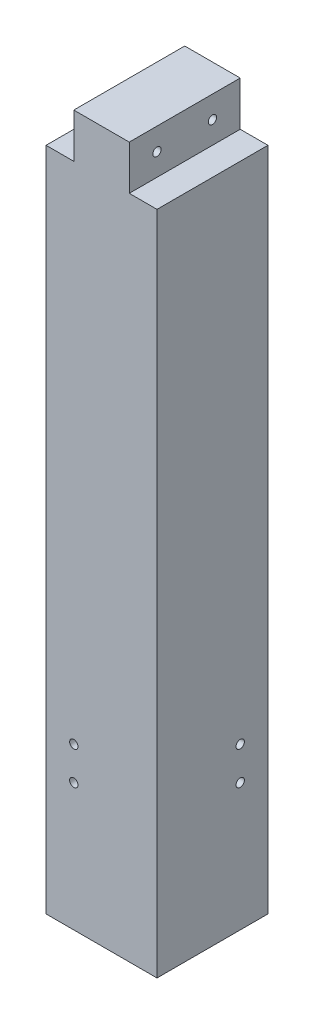
ISO-10303-21;
HEADER;
FILE_DESCRIPTION(('STEP AP214'),'2;1');
FILE_NAME('part.step','',(''),(''),'','','');
FILE_SCHEMA(('AUTOMOTIVE_DESIGN { 1 0 10303 214 1 1 1 1 }'));
ENDSEC;
DATA;
#1=APPLICATION_CONTEXT('core data for automotive mechanical design processes');
#2=APPLICATION_PROTOCOL_DEFINITION('international standard','automotive_design',2000,#1);
#3=PRODUCT_CONTEXT('',#1,'mechanical');
#4=PRODUCT('Part','Part','',(#3));
#5=PRODUCT_RELATED_PRODUCT_CATEGORY('part','',(#4));
#6=PRODUCT_DEFINITION_FORMATION('','',#4);
#7=PRODUCT_DEFINITION_CONTEXT('part definition',#1,'design');
#8=PRODUCT_DEFINITION('design','',#6,#7);
#9=PRODUCT_DEFINITION_SHAPE('','',#8);
#10=(LENGTH_UNIT() NAMED_UNIT(*) SI_UNIT(.MILLI.,.METRE.));
#11=(NAMED_UNIT(*) PLANE_ANGLE_UNIT() SI_UNIT($,.RADIAN.));
#12=(NAMED_UNIT(*) SI_UNIT($,.STERADIAN.) SOLID_ANGLE_UNIT());
#13=UNCERTAINTY_MEASURE_WITH_UNIT(LENGTH_MEASURE(1.E-05),#10,'distance_accuracy_value','');
#14=(GEOMETRIC_REPRESENTATION_CONTEXT(3) GLOBAL_UNCERTAINTY_ASSIGNED_CONTEXT((#13)) GLOBAL_UNIT_ASSIGNED_CONTEXT((#10,
#11,#12)) REPRESENTATION_CONTEXT('',''));
#15=CARTESIAN_POINT('',(0.,0.,0.));
#16=DIRECTION('',(0.,0.,1.));
#17=DIRECTION('',(1.,0.,0.));
#18=AXIS2_PLACEMENT_3D('',#15,#16,#17);
#19=CARTESIAN_POINT('',(0.,431.799999999999,-127.));
#20=DIRECTION('',(0.,1.,0.));
#21=DIRECTION('',(0.,0.,1.));
#22=AXIS2_PLACEMENT_3D('',#19,#20,#21);
#23=PLANE('',#22);
#24=DIRECTION('',(-1.,0.,0.));
#25=VECTOR('',#24,1.);
#26=CARTESIAN_POINT('',(0.,431.799999999999,0.));
#27=LINE('',#26,#25);
#28=CARTESIAN_POINT('',(31.75,431.799999999999,0.));
#29=VERTEX_POINT('',#28);
#30=CARTESIAN_POINT('',(-31.75,431.799999999999,0.));
#31=VERTEX_POINT('',#30);
#32=EDGE_CURVE('E233',#29,#31,#27,.T.);
#33=ORIENTED_EDGE('',*,*,#32,.F.);
#34=DIRECTION('',(0.,0.,1.));
#35=VECTOR('',#34,1.);
#36=CARTESIAN_POINT('',(31.75,431.799999999999,-127.));
#37=LINE('',#36,#35);
#38=CARTESIAN_POINT('',(31.75,431.799999999999,-127.));
#39=VERTEX_POINT('',#38);
#40=EDGE_CURVE('E11',#39,#29,#37,.T.);
#41=ORIENTED_EDGE('',*,*,#40,.F.);
#42=DIRECTION('',(-1.,0.,0.));
#43=VECTOR('',#42,1.);
#44=CARTESIAN_POINT('',(0.,431.799999999999,-127.));
#45=LINE('',#44,#43);
#46=CARTESIAN_POINT('',(-31.75,431.799999999999,-127.));
#47=VERTEX_POINT('',#46);
#48=EDGE_CURVE('E222',#39,#47,#45,.T.);
#49=ORIENTED_EDGE('',*,*,#48,.T.);
#50=DIRECTION('',(0.,0.,1.));
#51=VECTOR('',#50,1.);
#52=CARTESIAN_POINT('',(-31.75,431.799999999999,-127.));
#53=LINE('',#52,#51);
#54=EDGE_CURVE('E232',#47,#31,#53,.T.);
#55=ORIENTED_EDGE('',*,*,#54,.T.);
#56=EDGE_LOOP('',(#33,#41,#49,#55));
#57=FACE_BOUND('',#56,.T.);
#58=ADVANCED_FACE('F36',(#57),#23,.T.);
#59=CARTESIAN_POINT('',(31.7500000000001,0.,-127.));
#60=DIRECTION('',(-1.,0.,0.));
#61=DIRECTION('',(0.,-1.,0.));
#62=AXIS2_PLACEMENT_3D('',#59,#60,#61);
#63=PLANE('',#62);
#64=CARTESIAN_POINT('',(31.75,406.399999999999,-31.75));
#65=DIRECTION('',(-1.,0.,0.));
#66=DIRECTION('',(0.,-1.,0.));
#67=AXIS2_PLACEMENT_3D('',#64,#65,#66);
#68=CIRCLE('',#67,4.7625);
#69=CARTESIAN_POINT('',(31.75,401.637499999999,-31.75));
#70=VERTEX_POINT('',#69);
#71=EDGE_CURVE('E652',#70,#70,#68,.T.);
#72=ORIENTED_EDGE('',*,*,#71,.T.);
#73=EDGE_LOOP('',(#72));
#74=FACE_BOUND('',#73,.T.);
#75=CARTESIAN_POINT('',(31.75,406.399999999999,-95.25));
#76=DIRECTION('',(-1.,0.,0.));
#77=DIRECTION('',(0.,-1.,0.));
#78=AXIS2_PLACEMENT_3D('',#75,#76,#77);
#79=CIRCLE('',#78,4.7625);
#80=CARTESIAN_POINT('',(31.75,401.637499999999,-95.25));
#81=VERTEX_POINT('',#80);
#82=EDGE_CURVE('E657',#81,#81,#79,.T.);
#83=ORIENTED_EDGE('',*,*,#82,.T.);
#84=EDGE_LOOP('',(#83));
#85=FACE_BOUND('',#84,.T.);
#86=DIRECTION('',(0.,-1.,0.));
#87=VECTOR('',#86,1.);
#88=CARTESIAN_POINT('',(31.7500000000001,0.,0.));
#89=LINE('',#88,#87);
#90=CARTESIAN_POINT('',(31.75,380.999999999999,0.));
#91=VERTEX_POINT('',#90);
#92=EDGE_CURVE('E226',#29,#91,#89,.T.);
#93=ORIENTED_EDGE('',*,*,#92,.T.);
#94=DIRECTION('',(0.,0.,1.));
#95=VECTOR('',#94,1.);
#96=CARTESIAN_POINT('',(31.75,380.999999999999,-127.));
#97=LINE('',#96,#95);
#98=CARTESIAN_POINT('',(31.75,380.999999999999,-127.));
#99=VERTEX_POINT('',#98);
#100=EDGE_CURVE('E45',#99,#91,#97,.T.);
#101=ORIENTED_EDGE('',*,*,#100,.F.);
#102=DIRECTION('',(0.,-1.,0.));
#103=VECTOR('',#102,1.);
#104=CARTESIAN_POINT('',(31.7500000000001,0.,-127.));
#105=LINE('',#104,#103);
#106=EDGE_CURVE('E229',#39,#99,#105,.T.);
#107=ORIENTED_EDGE('',*,*,#106,.F.);
#108=ORIENTED_EDGE('',*,*,#40,.T.);
#109=EDGE_LOOP('',(#93,#101,#107,#108));
#110=FACE_BOUND('',#109,.T.);
#111=ADVANCED_FACE('F339',(#74,#85,#110),#63,.F.);
#112=CARTESIAN_POINT('',(-31.7499999999999,0.,-127.));
#113=DIRECTION('',(-1.,0.,0.));
#114=DIRECTION('',(0.,-1.,0.));
#115=AXIS2_PLACEMENT_3D('',#112,#113,#114);
#116=PLANE('',#115);
#117=CARTESIAN_POINT('',(-31.75,406.399999999999,-31.75));
#118=DIRECTION('',(-1.,0.,0.));
#119=DIRECTION('',(0.,-1.,0.));
#120=AXIS2_PLACEMENT_3D('',#117,#118,#119);
#121=CIRCLE('',#120,4.7625);
#122=CARTESIAN_POINT('',(-31.75,401.637499999999,-31.75));
#123=VERTEX_POINT('',#122);
#124=EDGE_CURVE('E649',#123,#123,#121,.T.);
#125=ORIENTED_EDGE('',*,*,#124,.F.);
#126=EDGE_LOOP('',(#125));
#127=FACE_BOUND('',#126,.T.);
#128=CARTESIAN_POINT('',(-31.75,406.399999999999,-95.25));
#129=DIRECTION('',(-1.,0.,0.));
#130=DIRECTION('',(0.,-1.,0.));
#131=AXIS2_PLACEMENT_3D('',#128,#129,#130);
#132=CIRCLE('',#131,4.7625);
#133=CARTESIAN_POINT('',(-31.75,401.637499999999,-95.25));
#134=VERTEX_POINT('',#133);
#135=EDGE_CURVE('E654',#134,#134,#132,.T.);
#136=ORIENTED_EDGE('',*,*,#135,.F.);
#137=EDGE_LOOP('',(#136));
#138=FACE_BOUND('',#137,.T.);
#139=DIRECTION('',(0.,-1.,0.));
#140=VECTOR('',#139,1.);
#141=CARTESIAN_POINT('',(-31.7499999999999,0.,0.));
#142=LINE('',#141,#140);
#143=CARTESIAN_POINT('',(-31.75,380.999999999999,0.));
#144=VERTEX_POINT('',#143);
#145=EDGE_CURVE('E236',#31,#144,#142,.T.);
#146=ORIENTED_EDGE('',*,*,#145,.F.);
#147=ORIENTED_EDGE('',*,*,#54,.F.);
#148=DIRECTION('',(0.,-1.,0.));
#149=VECTOR('',#148,1.);
#150=CARTESIAN_POINT('',(-31.7499999999999,0.,-127.));
#151=LINE('',#150,#149);
#152=CARTESIAN_POINT('',(-31.75,380.999999999999,-127.));
#153=VERTEX_POINT('',#152);
#154=EDGE_CURVE('E225',#47,#153,#151,.T.);
#155=ORIENTED_EDGE('',*,*,#154,.T.);
#156=DIRECTION('',(0.,0.,1.));
#157=VECTOR('',#156,1.);
#158=CARTESIAN_POINT('',(-31.75,380.999999999999,-127.));
#159=LINE('',#158,#157);
#160=EDGE_CURVE('E243',#153,#144,#159,.T.);
#161=ORIENTED_EDGE('',*,*,#160,.T.);
#162=EDGE_LOOP('',(#146,#147,#155,#161));
#163=FACE_BOUND('',#162,.T.);
#164=ADVANCED_FACE('F346',(#127,#138,#163),#116,.T.);
#165=CARTESIAN_POINT('',(0.,0.,-127.));
#166=DIRECTION('',(0.,0.,1.));
#167=DIRECTION('',(1.,0.,0.));
#168=AXIS2_PLACEMENT_3D('',#165,#166,#167);
#169=PLANE('',#168);
#170=DIRECTION('',(-1.,0.,0.));
#171=VECTOR('',#170,1.);
#172=CARTESIAN_POINT('',(0.,-254.000000000001,-127.));
#173=LINE('',#172,#171);
#174=CARTESIAN_POINT('',(31.75,-254.000000000001,-127.));
#175=VERTEX_POINT('',#174);
#176=CARTESIAN_POINT('',(0.,-254.000000000001,-127.));
#177=VERTEX_POINT('',#176);
#178=EDGE_CURVE('E182',#175,#177,#173,.T.);
#179=ORIENTED_EDGE('',*,*,#178,.F.);
#180=DIRECTION('',(0.,-1.,0.));
#181=VECTOR('',#180,1.);
#182=CARTESIAN_POINT('',(31.75,-177.800000000001,-127.));
#183=LINE('',#182,#181);
#184=CARTESIAN_POINT('',(31.75,-177.800000000001,-127.));
#185=VERTEX_POINT('',#184);
#186=EDGE_CURVE('E53',#185,#175,#183,.T.);
#187=ORIENTED_EDGE('',*,*,#186,.F.);
#188=DIRECTION('',(1.,0.,0.));
#189=VECTOR('',#188,1.);
#190=CARTESIAN_POINT('',(0.,-177.800000000001,-127.));
#191=LINE('',#190,#189);
#192=CARTESIAN_POINT('',(0.,-177.800000000001,-127.));
#193=VERTEX_POINT('',#192);
#194=EDGE_CURVE('E170',#193,#185,#191,.T.);
#195=ORIENTED_EDGE('',*,*,#194,.F.);
#196=DIRECTION('',(0.,1.,0.));
#197=VECTOR('',#196,1.);
#198=CARTESIAN_POINT('',(0.,-177.800000000001,-127.));
#199=LINE('',#198,#197);
#200=EDGE_CURVE('E173',#177,#193,#199,.T.);
#201=ORIENTED_EDGE('',*,*,#200,.F.);
#202=EDGE_LOOP('',(#179,#187,#195,#201));
#203=FACE_BOUND('',#202,.T.);
#204=ORIENTED_EDGE('',*,*,#48,.F.);
#205=ORIENTED_EDGE('',*,*,#106,.T.);
#206=DIRECTION('',(-1.,0.,0.));
#207=VECTOR('',#206,1.);
#208=CARTESIAN_POINT('',(63.5,380.999999999999,-127.));
#209=LINE('',#208,#207);
#210=CARTESIAN_POINT('',(63.5,380.999999999999,-127.));
#211=VERTEX_POINT('',#210);
#212=EDGE_CURVE('E256',#211,#99,#209,.T.);
#213=ORIENTED_EDGE('',*,*,#212,.F.);
#214=DIRECTION('',(0.,-1.,0.));
#215=VECTOR('',#214,1.);
#216=CARTESIAN_POINT('',(63.5,380.999999999999,-127.));
#217=LINE('',#216,#215);
#218=CARTESIAN_POINT('',(63.5000000000004,-381.000000000001,-127.));
#219=VERTEX_POINT('',#218);
#220=EDGE_CURVE('E246',#211,#219,#217,.T.);
#221=ORIENTED_EDGE('',*,*,#220,.T.);
#222=DIRECTION('',(-1.,0.,0.));
#223=VECTOR('',#222,1.);
#224=CARTESIAN_POINT('',(63.5000000000004,-381.000000000001,-127.));
#225=LINE('',#224,#223);
#226=CARTESIAN_POINT('',(-63.4999999999999,-381.000000000001,-127.));
#227=VERTEX_POINT('',#226);
#228=EDGE_CURVE('E249',#219,#227,#225,.T.);
#229=ORIENTED_EDGE('',*,*,#228,.T.);
#230=DIRECTION('',(0.,-1.,0.));
#231=VECTOR('',#230,1.);
#232=CARTESIAN_POINT('',(-63.5,380.999999999999,-127.));
#233=LINE('',#232,#231);
#234=CARTESIAN_POINT('',(-63.5,380.999999999999,-127.));
#235=VERTEX_POINT('',#234);
#236=EDGE_CURVE('E252',#235,#227,#233,.T.);
#237=ORIENTED_EDGE('',*,*,#236,.F.);
#238=EDGE_CURVE('E255',#153,#235,#209,.T.);
#239=ORIENTED_EDGE('',*,*,#238,.F.);
#240=ORIENTED_EDGE('',*,*,#154,.F.);
#241=EDGE_LOOP('',(#204,#205,#213,#221,#229,#237,#239,#240));
#242=FACE_BOUND('',#241,.T.);
#243=ADVANCED_FACE('F357',(#203,#242),#169,.F.);
#244=CARTESIAN_POINT('',(0.,0.,0.));
#245=DIRECTION('',(0.,0.,1.));
#246=DIRECTION('',(1.,0.,0.));
#247=AXIS2_PLACEMENT_3D('',#244,#245,#246);
#248=PLANE('',#247);
#249=CARTESIAN_POINT('',(-31.7499999999999,-196.850000000001,0.));
#250=DIRECTION('',(0.,0.,1.));
#251=DIRECTION('',(1.,0.,0.));
#252=AXIS2_PLACEMENT_3D('',#249,#250,#251);
#253=CIRCLE('',#252,4.7625);
#254=CARTESIAN_POINT('',(-26.9874999999999,-196.850000000001,0.));
#255=VERTEX_POINT('',#254);
#256=EDGE_CURVE('E663',#255,#255,#253,.T.);
#257=ORIENTED_EDGE('',*,*,#256,.F.);
#258=EDGE_LOOP('',(#257));
#259=FACE_BOUND('',#258,.T.);
#260=CARTESIAN_POINT('',(-31.7499999999999,-234.950000000001,0.));
#261=DIRECTION('',(0.,0.,1.));
#262=DIRECTION('',(1.,0.,0.));
#263=AXIS2_PLACEMENT_3D('',#260,#261,#262);
#264=CIRCLE('',#263,4.7625);
#265=CARTESIAN_POINT('',(-26.9874999999999,-234.950000000001,0.));
#266=VERTEX_POINT('',#265);
#267=EDGE_CURVE('E297',#266,#266,#264,.T.);
#268=ORIENTED_EDGE('',*,*,#267,.F.);
#269=EDGE_LOOP('',(#268));
#270=FACE_BOUND('',#269,.T.);
#271=ORIENTED_EDGE('',*,*,#32,.T.);
#272=ORIENTED_EDGE('',*,*,#145,.T.);
#273=DIRECTION('',(-1.,0.,0.));
#274=VECTOR('',#273,1.);
#275=CARTESIAN_POINT('',(63.5,380.999999999999,0.));
#276=LINE('',#275,#274);
#277=CARTESIAN_POINT('',(-63.5,380.999999999999,0.));
#278=VERTEX_POINT('',#277);
#279=EDGE_CURVE('E268',#144,#278,#276,.T.);
#280=ORIENTED_EDGE('',*,*,#279,.T.);
#281=DIRECTION('',(0.,-1.,0.));
#282=VECTOR('',#281,1.);
#283=CARTESIAN_POINT('',(-63.5,380.999999999999,0.));
#284=LINE('',#283,#282);
#285=CARTESIAN_POINT('',(-63.4999999999999,-381.000000000001,0.));
#286=VERTEX_POINT('',#285);
#287=EDGE_CURVE('E265',#278,#286,#284,.T.);
#288=ORIENTED_EDGE('',*,*,#287,.T.);
#289=DIRECTION('',(-1.,0.,0.));
#290=VECTOR('',#289,1.);
#291=CARTESIAN_POINT('',(63.5000000000004,-381.000000000001,0.));
#292=LINE('',#291,#290);
#293=CARTESIAN_POINT('',(63.5000000000004,-381.000000000001,0.));
#294=VERTEX_POINT('',#293);
#295=EDGE_CURVE('E262',#294,#286,#292,.T.);
#296=ORIENTED_EDGE('',*,*,#295,.F.);
#297=DIRECTION('',(0.,-1.,0.));
#298=VECTOR('',#297,1.);
#299=CARTESIAN_POINT('',(63.5,380.999999999999,0.));
#300=LINE('',#299,#298);
#301=CARTESIAN_POINT('',(63.5,380.999999999999,0.));
#302=VERTEX_POINT('',#301);
#303=EDGE_CURVE('E216',#302,#294,#300,.T.);
#304=ORIENTED_EDGE('',*,*,#303,.F.);
#305=EDGE_CURVE('E250',#302,#91,#276,.T.);
#306=ORIENTED_EDGE('',*,*,#305,.T.);
#307=ORIENTED_EDGE('',*,*,#92,.F.);
#308=EDGE_LOOP('',(#271,#272,#280,#288,#296,#304,#306,#307));
#309=FACE_BOUND('',#308,.T.);
#310=ADVANCED_FACE('F333',(#259,#270,#309),#248,.T.);
#311=CARTESIAN_POINT('',(63.5000000000004,-381.000000000001,-127.));
#312=DIRECTION('',(0.,1.,0.));
#313=DIRECTION('',(-1.,0.,0.));
#314=AXIS2_PLACEMENT_3D('',#311,#312,#313);
#315=PLANE('',#314);
#316=ORIENTED_EDGE('',*,*,#295,.T.);
#317=DIRECTION('',(0.,0.,1.));
#318=VECTOR('',#317,1.);
#319=CARTESIAN_POINT('',(-63.4999999999999,-381.000000000001,-127.));
#320=LINE('',#319,#318);
#321=EDGE_CURVE('E275',#227,#286,#320,.T.);
#322=ORIENTED_EDGE('',*,*,#321,.F.);
#323=ORIENTED_EDGE('',*,*,#228,.F.);
#324=DIRECTION('',(0.,0.,1.));
#325=VECTOR('',#324,1.);
#326=CARTESIAN_POINT('',(63.5000000000004,-381.000000000001,-127.));
#327=LINE('',#326,#325);
#328=EDGE_CURVE('E237',#219,#294,#327,.T.);
#329=ORIENTED_EDGE('',*,*,#328,.T.);
#330=EDGE_LOOP('',(#316,#322,#323,#329));
#331=FACE_BOUND('',#330,.T.);
#332=ADVANCED_FACE('F326',(#331),#315,.F.);
#333=CARTESIAN_POINT('',(-63.5,380.999999999999,-127.));
#334=DIRECTION('',(-1.,0.,0.));
#335=DIRECTION('',(0.,-1.,0.));
#336=AXIS2_PLACEMENT_3D('',#333,#334,#335);
#337=PLANE('',#336);
#338=DIRECTION('',(0.,-1.,0.));
#339=VECTOR('',#338,1.);
#340=CARTESIAN_POINT('',(-63.4999999999999,-177.800000000001,-63.5));
#341=LINE('',#340,#339);
#342=CARTESIAN_POINT('',(-63.4999999999999,-177.800000000001,-63.5));
#343=VERTEX_POINT('',#342);
#344=CARTESIAN_POINT('',(-63.4999999999999,-254.000000000001,-63.5));
#345=VERTEX_POINT('',#344);
#346=EDGE_CURVE('E61',#343,#345,#341,.T.);
#347=ORIENTED_EDGE('',*,*,#346,.F.);
#348=DIRECTION('',(0.,0.,-1.));
#349=VECTOR('',#348,1.);
#350=CARTESIAN_POINT('',(-63.4999999999999,-177.800000000001,-31.75));
#351=LINE('',#350,#349);
#352=CARTESIAN_POINT('',(-63.4999999999999,-177.800000000001,-31.75));
#353=VERTEX_POINT('',#352);
#354=EDGE_CURVE('E195',#353,#343,#351,.T.);
#355=ORIENTED_EDGE('',*,*,#354,.F.);
#356=DIRECTION('',(0.,1.,0.));
#357=VECTOR('',#356,1.);
#358=CARTESIAN_POINT('',(-63.4999999999999,-177.800000000001,-31.75));
#359=LINE('',#358,#357);
#360=CARTESIAN_POINT('',(-63.4999999999999,-254.000000000001,-31.75));
#361=VERTEX_POINT('',#360);
#362=EDGE_CURVE('E209',#361,#353,#359,.T.);
#363=ORIENTED_EDGE('',*,*,#362,.F.);
#364=DIRECTION('',(0.,0.,1.));
#365=VECTOR('',#364,1.);
#366=CARTESIAN_POINT('',(-63.4999999999999,-254.000000000001,-31.75));
#367=LINE('',#366,#365);
#368=EDGE_CURVE('E206',#345,#361,#367,.T.);
#369=ORIENTED_EDGE('',*,*,#368,.F.);
#370=EDGE_LOOP('',(#347,#355,#363,#369));
#371=FACE_BOUND('',#370,.T.);
#372=ORIENTED_EDGE('',*,*,#287,.F.);
#373=DIRECTION('',(0.,0.,1.));
#374=VECTOR('',#373,1.);
#375=CARTESIAN_POINT('',(-63.5,380.999999999999,-127.));
#376=LINE('',#375,#374);
#377=EDGE_CURVE('E272',#235,#278,#376,.T.);
#378=ORIENTED_EDGE('',*,*,#377,.F.);
#379=ORIENTED_EDGE('',*,*,#236,.T.);
#380=ORIENTED_EDGE('',*,*,#321,.T.);
#381=EDGE_LOOP('',(#372,#378,#379,#380));
#382=FACE_BOUND('',#381,.T.);
#383=ADVANCED_FACE('F324',(#371,#382),#337,.T.);
#384=CARTESIAN_POINT('',(63.5,380.999999999999,-127.));
#385=DIRECTION('',(-1.,0.,0.));
#386=DIRECTION('',(0.,-1.,0.));
#387=AXIS2_PLACEMENT_3D('',#384,#385,#386);
#388=PLANE('',#387);
#389=CARTESIAN_POINT('',(63.5000000000002,-196.850000000001,-95.25));
#390=DIRECTION('',(1.,0.,0.));
#391=DIRECTION('',(0.,1.,0.));
#392=AXIS2_PLACEMENT_3D('',#389,#390,#391);
#393=CIRCLE('',#392,4.7625);
#394=CARTESIAN_POINT('',(63.5000000000002,-192.087500000001,-95.25));
#395=VERTEX_POINT('',#394);
#396=EDGE_CURVE('E294',#395,#395,#393,.T.);
#397=ORIENTED_EDGE('',*,*,#396,.F.);
#398=EDGE_LOOP('',(#397));
#399=FACE_BOUND('',#398,.T.);
#400=CARTESIAN_POINT('',(63.5000000000002,-234.950000000001,-95.25));
#401=DIRECTION('',(1.,0.,0.));
#402=DIRECTION('',(0.,1.,0.));
#403=AXIS2_PLACEMENT_3D('',#400,#401,#402);
#404=CIRCLE('',#403,4.7625);
#405=CARTESIAN_POINT('',(63.5000000000002,-230.187500000001,-95.25));
#406=VERTEX_POINT('',#405);
#407=EDGE_CURVE('E313',#406,#406,#404,.T.);
#408=ORIENTED_EDGE('',*,*,#407,.F.);
#409=EDGE_LOOP('',(#408));
#410=FACE_BOUND('',#409,.T.);
#411=ORIENTED_EDGE('',*,*,#303,.T.);
#412=ORIENTED_EDGE('',*,*,#328,.F.);
#413=ORIENTED_EDGE('',*,*,#220,.F.);
#414=DIRECTION('',(0.,0.,1.));
#415=VECTOR('',#414,1.);
#416=CARTESIAN_POINT('',(63.5,380.999999999999,-127.));
#417=LINE('',#416,#415);
#418=EDGE_CURVE('E259',#211,#302,#417,.T.);
#419=ORIENTED_EDGE('',*,*,#418,.T.);
#420=EDGE_LOOP('',(#411,#412,#413,#419));
#421=FACE_BOUND('',#420,.T.);
#422=ADVANCED_FACE('F38',(#399,#410,#421),#388,.F.);
#423=CARTESIAN_POINT('',(63.5,380.999999999999,-127.));
#424=DIRECTION('',(0.,1.,0.));
#425=DIRECTION('',(-1.,0.,0.));
#426=AXIS2_PLACEMENT_3D('',#423,#424,#425);
#427=PLANE('',#426);
#428=ORIENTED_EDGE('',*,*,#212,.T.);
#429=ORIENTED_EDGE('',*,*,#100,.T.);
#430=ORIENTED_EDGE('',*,*,#305,.F.);
#431=ORIENTED_EDGE('',*,*,#418,.F.);
#432=EDGE_LOOP('',(#428,#429,#430,#431));
#433=FACE_BOUND('',#432,.T.);
#434=ADVANCED_FACE('F323',(#433),#427,.T.);
#435=ORIENTED_EDGE('',*,*,#160,.F.);
#436=ORIENTED_EDGE('',*,*,#238,.T.);
#437=ORIENTED_EDGE('',*,*,#377,.T.);
#438=ORIENTED_EDGE('',*,*,#279,.F.);
#439=EDGE_LOOP('',(#435,#436,#437,#438));
#440=FACE_BOUND('',#439,.T.);
#441=ADVANCED_FACE('F327',(#440),#427,.T.);
#442=CARTESIAN_POINT('',(0.,-177.800000000001,-63.5));
#443=DIRECTION('',(0.,0.,-1.));
#444=DIRECTION('',(-1.,0.,0.));
#445=AXIS2_PLACEMENT_3D('',#442,#443,#444);
#446=PLANE('',#445);
#447=CARTESIAN_POINT('',(-31.7499999999999,-196.850000000001,-63.5));
#448=DIRECTION('',(0.,0.,-1.));
#449=DIRECTION('',(-1.,0.,0.));
#450=AXIS2_PLACEMENT_3D('',#447,#448,#449);
#451=CIRCLE('',#450,4.7625);
#452=CARTESIAN_POINT('',(-36.5124999999999,-196.850000000001,-63.5));
#453=VERTEX_POINT('',#452);
#454=EDGE_CURVE('E302',#453,#453,#451,.T.);
#455=ORIENTED_EDGE('',*,*,#454,.T.);
#456=EDGE_LOOP('',(#455));
#457=FACE_BOUND('',#456,.T.);
#458=CARTESIAN_POINT('',(-31.7499999999999,-234.950000000001,-63.5));
#459=DIRECTION('',(0.,0.,-1.));
#460=DIRECTION('',(-1.,0.,0.));
#461=AXIS2_PLACEMENT_3D('',#458,#459,#460);
#462=CIRCLE('',#461,4.7625);
#463=CARTESIAN_POINT('',(-36.5124999999999,-234.950000000001,-63.5));
#464=VERTEX_POINT('',#463);
#465=EDGE_CURVE('E289',#464,#464,#462,.T.);
#466=ORIENTED_EDGE('',*,*,#465,.T.);
#467=EDGE_LOOP('',(#466));
#468=FACE_BOUND('',#467,.T.);
#469=ORIENTED_EDGE('',*,*,#346,.T.);
#470=DIRECTION('',(-1.,0.,0.));
#471=VECTOR('',#470,1.);
#472=CARTESIAN_POINT('',(0.,-254.000000000001,-63.5));
#473=LINE('',#472,#471);
#474=CARTESIAN_POINT('',(0.,-254.000000000001,-63.5));
#475=VERTEX_POINT('',#474);
#476=EDGE_CURVE('E204',#475,#345,#473,.T.);
#477=ORIENTED_EDGE('',*,*,#476,.F.);
#478=DIRECTION('',(0.,-1.,0.));
#479=VECTOR('',#478,1.);
#480=CARTESIAN_POINT('',(0.,-177.800000000001,-63.5));
#481=LINE('',#480,#479);
#482=CARTESIAN_POINT('',(0.,-177.800000000001,-63.5));
#483=VERTEX_POINT('',#482);
#484=EDGE_CURVE('E191',#483,#475,#481,.T.);
#485=ORIENTED_EDGE('',*,*,#484,.F.);
#486=DIRECTION('',(-1.,0.,0.));
#487=VECTOR('',#486,1.);
#488=CARTESIAN_POINT('',(0.,-177.800000000001,-63.5));
#489=LINE('',#488,#487);
#490=EDGE_CURVE('E214',#483,#343,#489,.T.);
#491=ORIENTED_EDGE('',*,*,#490,.T.);
#492=EDGE_LOOP('',(#469,#477,#485,#491));
#493=FACE_BOUND('',#492,.T.);
#494=ADVANCED_FACE('F367',(#457,#468,#493),#446,.F.);
#495=CARTESIAN_POINT('',(0.,-177.800000000001,-31.75));
#496=DIRECTION('',(0.,1.,0.));
#497=DIRECTION('',(-1.,0.,0.));
#498=AXIS2_PLACEMENT_3D('',#495,#496,#497);
#499=PLANE('',#498);
#500=ORIENTED_EDGE('',*,*,#354,.T.);
#501=ORIENTED_EDGE('',*,*,#490,.F.);
#502=DIRECTION('',(0.,0.,-1.));
#503=VECTOR('',#502,1.);
#504=CARTESIAN_POINT('',(0.,-177.800000000001,-31.75));
#505=LINE('',#504,#503);
#506=CARTESIAN_POINT('',(0.,-177.800000000001,-31.75));
#507=VERTEX_POINT('',#506);
#508=EDGE_CURVE('E201',#507,#483,#505,.T.);
#509=ORIENTED_EDGE('',*,*,#508,.F.);
#510=DIRECTION('',(-1.,0.,0.));
#511=VECTOR('',#510,1.);
#512=CARTESIAN_POINT('',(0.,-177.800000000001,-31.75));
#513=LINE('',#512,#511);
#514=EDGE_CURVE('E217',#507,#353,#513,.T.);
#515=ORIENTED_EDGE('',*,*,#514,.T.);
#516=EDGE_LOOP('',(#500,#501,#509,#515));
#517=FACE_BOUND('',#516,.T.);
#518=ADVANCED_FACE('F377',(#517),#499,.F.);
#519=CARTESIAN_POINT('',(0.,-177.800000000001,-31.75));
#520=DIRECTION('',(0.,0.,1.));
#521=DIRECTION('',(1.,0.,0.));
#522=AXIS2_PLACEMENT_3D('',#519,#520,#521);
#523=PLANE('',#522);
#524=CARTESIAN_POINT('',(-31.7499999999999,-196.850000000001,-31.75));
#525=DIRECTION('',(0.,0.,1.));
#526=DIRECTION('',(1.,0.,0.));
#527=AXIS2_PLACEMENT_3D('',#524,#525,#526);
#528=CIRCLE('',#527,4.7625);
#529=CARTESIAN_POINT('',(-26.9874999999999,-196.850000000001,-31.75));
#530=VERTEX_POINT('',#529);
#531=EDGE_CURVE('E40',#530,#530,#528,.T.);
#532=ORIENTED_EDGE('',*,*,#531,.T.);
#533=EDGE_LOOP('',(#532));
#534=FACE_BOUND('',#533,.T.);
#535=CARTESIAN_POINT('',(-31.7499999999999,-234.950000000001,-31.75));
#536=DIRECTION('',(0.,0.,1.));
#537=DIRECTION('',(1.,0.,0.));
#538=AXIS2_PLACEMENT_3D('',#535,#536,#537);
#539=CIRCLE('',#538,4.7625);
#540=CARTESIAN_POINT('',(-26.9874999999999,-234.950000000001,-31.75));
#541=VERTEX_POINT('',#540);
#542=EDGE_CURVE('E287',#541,#541,#539,.T.);
#543=ORIENTED_EDGE('',*,*,#542,.T.);
#544=EDGE_LOOP('',(#543));
#545=FACE_BOUND('',#544,.T.);
#546=ORIENTED_EDGE('',*,*,#362,.T.);
#547=ORIENTED_EDGE('',*,*,#514,.F.);
#548=DIRECTION('',(0.,1.,0.));
#549=VECTOR('',#548,1.);
#550=CARTESIAN_POINT('',(0.,-177.800000000001,-31.75));
#551=LINE('',#550,#549);
#552=CARTESIAN_POINT('',(0.,-254.000000000001,-31.75));
#553=VERTEX_POINT('',#552);
#554=EDGE_CURVE('E198',#553,#507,#551,.T.);
#555=ORIENTED_EDGE('',*,*,#554,.F.);
#556=DIRECTION('',(-1.,0.,0.));
#557=VECTOR('',#556,1.);
#558=CARTESIAN_POINT('',(0.,-254.000000000001,-31.75));
#559=LINE('',#558,#557);
#560=EDGE_CURVE('E219',#553,#361,#559,.T.);
#561=ORIENTED_EDGE('',*,*,#560,.T.);
#562=EDGE_LOOP('',(#546,#547,#555,#561));
#563=FACE_BOUND('',#562,.T.);
#564=ADVANCED_FACE('F423',(#534,#545,#563),#523,.F.);
#565=CARTESIAN_POINT('',(0.,-254.000000000001,-31.75));
#566=DIRECTION('',(0.,-1.,0.));
#567=DIRECTION('',(1.,0.,0.));
#568=AXIS2_PLACEMENT_3D('',#565,#566,#567);
#569=PLANE('',#568);
#570=ORIENTED_EDGE('',*,*,#368,.T.);
#571=ORIENTED_EDGE('',*,*,#560,.F.);
#572=DIRECTION('',(0.,0.,1.));
#573=VECTOR('',#572,1.);
#574=CARTESIAN_POINT('',(0.,-254.000000000001,-31.75));
#575=LINE('',#574,#573);
#576=EDGE_CURVE('E194',#475,#553,#575,.T.);
#577=ORIENTED_EDGE('',*,*,#576,.F.);
#578=ORIENTED_EDGE('',*,*,#476,.T.);
#579=EDGE_LOOP('',(#570,#571,#577,#578));
#580=FACE_BOUND('',#579,.T.);
#581=ADVANCED_FACE('F432',(#580),#569,.F.);
#582=CARTESIAN_POINT('',(0.,0.,0.));
#583=DIRECTION('',(1.,0.,0.));
#584=DIRECTION('',(0.,1.,0.));
#585=AXIS2_PLACEMENT_3D('',#582,#583,#584);
#586=PLANE('',#585);
#587=ORIENTED_EDGE('',*,*,#484,.T.);
#588=ORIENTED_EDGE('',*,*,#576,.T.);
#589=ORIENTED_EDGE('',*,*,#554,.T.);
#590=ORIENTED_EDGE('',*,*,#508,.T.);
#591=EDGE_LOOP('',(#587,#588,#589,#590));
#592=FACE_BOUND('',#591,.T.);
#593=ADVANCED_FACE('F441',(#592),#586,.F.);
#594=CARTESIAN_POINT('',(31.75,-177.800000000001,-63.754));
#595=DIRECTION('',(1.,0.,0.));
#596=DIRECTION('',(0.,0.,-1.));
#597=AXIS2_PLACEMENT_3D('',#594,#595,#596);
#598=PLANE('',#597);
#599=CARTESIAN_POINT('',(31.75,-196.850000000001,-95.25));
#600=DIRECTION('',(1.,0.,0.));
#601=DIRECTION('',(0.,0.,-1.));
#602=AXIS2_PLACEMENT_3D('',#599,#600,#601);
#603=CIRCLE('',#602,4.7625);
#604=CARTESIAN_POINT('',(31.75,-196.850000000001,-100.0125));
#605=VERTEX_POINT('',#604);
#606=EDGE_CURVE('E285',#605,#605,#603,.T.);
#607=ORIENTED_EDGE('',*,*,#606,.T.);
#608=EDGE_LOOP('',(#607));
#609=FACE_BOUND('',#608,.T.);
#610=CARTESIAN_POINT('',(31.75,-234.950000000001,-95.25));
#611=DIRECTION('',(1.,0.,0.));
#612=DIRECTION('',(0.,0.,-1.));
#613=AXIS2_PLACEMENT_3D('',#610,#611,#612);
#614=CIRCLE('',#613,4.7625);
#615=CARTESIAN_POINT('',(31.75,-234.950000000001,-100.0125));
#616=VERTEX_POINT('',#615);
#617=EDGE_CURVE('E176',#616,#616,#614,.T.);
#618=ORIENTED_EDGE('',*,*,#617,.T.);
#619=EDGE_LOOP('',(#618));
#620=FACE_BOUND('',#619,.T.);
#621=ORIENTED_EDGE('',*,*,#186,.T.);
#622=DIRECTION('',(0.,0.,-1.));
#623=VECTOR('',#622,1.);
#624=CARTESIAN_POINT('',(31.75,-254.000000000001,-63.754));
#625=LINE('',#624,#623);
#626=CARTESIAN_POINT('',(31.75,-254.000000000001,-63.754));
#627=VERTEX_POINT('',#626);
#628=EDGE_CURVE('E148',#627,#175,#625,.T.);
#629=ORIENTED_EDGE('',*,*,#628,.F.);
#630=DIRECTION('',(0.,-1.,0.));
#631=VECTOR('',#630,1.);
#632=CARTESIAN_POINT('',(31.75,-177.800000000001,-63.754));
#633=LINE('',#632,#631);
#634=CARTESIAN_POINT('',(31.75,-177.800000000001,-63.754));
#635=VERTEX_POINT('',#634);
#636=EDGE_CURVE('E152',#635,#627,#633,.T.);
#637=ORIENTED_EDGE('',*,*,#636,.F.);
#638=DIRECTION('',(0.,0.,-1.));
#639=VECTOR('',#638,1.);
#640=CARTESIAN_POINT('',(31.75,-177.800000000001,-63.754));
#641=LINE('',#640,#639);
#642=EDGE_CURVE('E186',#635,#185,#641,.T.);
#643=ORIENTED_EDGE('',*,*,#642,.T.);
#644=EDGE_LOOP('',(#621,#629,#637,#643));
#645=FACE_BOUND('',#644,.T.);
#646=ADVANCED_FACE('F150',(#609,#620,#645),#598,.F.);
#647=CARTESIAN_POINT('',(0.,-177.800000000001,-63.754));
#648=DIRECTION('',(0.,1.,0.));
#649=DIRECTION('',(0.,0.,1.));
#650=AXIS2_PLACEMENT_3D('',#647,#648,#649);
#651=PLANE('',#650);
#652=ORIENTED_EDGE('',*,*,#194,.T.);
#653=ORIENTED_EDGE('',*,*,#642,.F.);
#654=DIRECTION('',(1.,0.,0.));
#655=VECTOR('',#654,1.);
#656=CARTESIAN_POINT('',(0.,-177.800000000001,-63.754));
#657=LINE('',#656,#655);
#658=CARTESIAN_POINT('',(0.,-177.800000000001,-63.754));
#659=VERTEX_POINT('',#658);
#660=EDGE_CURVE('E158',#659,#635,#657,.T.);
#661=ORIENTED_EDGE('',*,*,#660,.F.);
#662=DIRECTION('',(0.,0.,-1.));
#663=VECTOR('',#662,1.);
#664=CARTESIAN_POINT('',(0.,-177.800000000001,-63.754));
#665=LINE('',#664,#663);
#666=EDGE_CURVE('E188',#659,#193,#665,.T.);
#667=ORIENTED_EDGE('',*,*,#666,.T.);
#668=EDGE_LOOP('',(#652,#653,#661,#667));
#669=FACE_BOUND('',#668,.T.);
#670=ADVANCED_FACE('F457',(#669),#651,.F.);
#671=CARTESIAN_POINT('',(0.,-177.800000000001,-63.754));
#672=DIRECTION('',(-1.,0.,0.));
#673=DIRECTION('',(0.,-1.,0.));
#674=AXIS2_PLACEMENT_3D('',#671,#672,#673);
#675=PLANE('',#674);
#676=CARTESIAN_POINT('',(0.,-196.850000000001,-95.25));
#677=DIRECTION('',(-1.,0.,0.));
#678=DIRECTION('',(0.,-1.,0.));
#679=AXIS2_PLACEMENT_3D('',#676,#677,#678);
#680=CIRCLE('',#679,4.7625);
#681=CARTESIAN_POINT('',(0.,-201.612500000001,-95.25));
#682=VERTEX_POINT('',#681);
#683=EDGE_CURVE('E283',#682,#682,#680,.T.);
#684=ORIENTED_EDGE('',*,*,#683,.T.);
#685=EDGE_LOOP('',(#684));
#686=FACE_BOUND('',#685,.T.);
#687=CARTESIAN_POINT('',(0.,-234.950000000001,-95.25));
#688=DIRECTION('',(-1.,0.,0.));
#689=DIRECTION('',(0.,-1.,0.));
#690=AXIS2_PLACEMENT_3D('',#687,#688,#689);
#691=CIRCLE('',#690,4.7625);
#692=CARTESIAN_POINT('',(0.,-239.712500000001,-95.25));
#693=VERTEX_POINT('',#692);
#694=EDGE_CURVE('E279',#693,#693,#691,.T.);
#695=ORIENTED_EDGE('',*,*,#694,.T.);
#696=EDGE_LOOP('',(#695));
#697=FACE_BOUND('',#696,.T.);
#698=ORIENTED_EDGE('',*,*,#200,.T.);
#699=ORIENTED_EDGE('',*,*,#666,.F.);
#700=DIRECTION('',(0.,1.,0.));
#701=VECTOR('',#700,1.);
#702=CARTESIAN_POINT('',(0.,-177.800000000001,-63.754));
#703=LINE('',#702,#701);
#704=CARTESIAN_POINT('',(0.,-254.000000000001,-63.754));
#705=VERTEX_POINT('',#704);
#706=EDGE_CURVE('E166',#705,#659,#703,.T.);
#707=ORIENTED_EDGE('',*,*,#706,.F.);
#708=DIRECTION('',(0.,0.,-1.));
#709=VECTOR('',#708,1.);
#710=CARTESIAN_POINT('',(0.,-254.000000000001,-63.754));
#711=LINE('',#710,#709);
#712=EDGE_CURVE('E157',#705,#177,#711,.T.);
#713=ORIENTED_EDGE('',*,*,#712,.T.);
#714=EDGE_LOOP('',(#698,#699,#707,#713));
#715=FACE_BOUND('',#714,.T.);
#716=ADVANCED_FACE('F467',(#686,#697,#715),#675,.F.);
#717=CARTESIAN_POINT('',(0.,-254.000000000001,-63.754));
#718=DIRECTION('',(0.,-1.,0.));
#719=DIRECTION('',(0.,0.,-1.));
#720=AXIS2_PLACEMENT_3D('',#717,#718,#719);
#721=PLANE('',#720);
#722=ORIENTED_EDGE('',*,*,#178,.T.);
#723=ORIENTED_EDGE('',*,*,#712,.F.);
#724=DIRECTION('',(-1.,0.,0.));
#725=VECTOR('',#724,1.);
#726=CARTESIAN_POINT('',(0.,-254.000000000001,-63.754));
#727=LINE('',#726,#725);
#728=EDGE_CURVE('E161',#627,#705,#727,.T.);
#729=ORIENTED_EDGE('',*,*,#728,.F.);
#730=ORIENTED_EDGE('',*,*,#628,.T.);
#731=EDGE_LOOP('',(#722,#723,#729,#730));
#732=FACE_BOUND('',#731,.T.);
#733=ADVANCED_FACE('F162',(#732),#721,.F.);
#734=CARTESIAN_POINT('',(0.,0.,-63.754));
#735=DIRECTION('',(0.,0.,1.));
#736=DIRECTION('',(1.,0.,0.));
#737=AXIS2_PLACEMENT_3D('',#734,#735,#736);
#738=PLANE('',#737);
#739=ORIENTED_EDGE('',*,*,#636,.T.);
#740=ORIENTED_EDGE('',*,*,#728,.T.);
#741=ORIENTED_EDGE('',*,*,#706,.T.);
#742=ORIENTED_EDGE('',*,*,#660,.T.);
#743=EDGE_LOOP('',(#739,#740,#741,#742));
#744=FACE_BOUND('',#743,.T.);
#745=ADVANCED_FACE('F168',(#744),#738,.F.);
#746=CARTESIAN_POINT('',(-6.3499999999998,0.,0.));
#747=DIRECTION('',(1.,0.,0.));
#748=DIRECTION('',(0.,1.,0.));
#749=AXIS2_PLACEMENT_3D('',#746,#747,#748);
#750=PLANE('',#749);
#751=CARTESIAN_POINT('',(-6.34999999999977,-234.950000000001,-95.25));
#752=DIRECTION('',(1.,0.,0.));
#753=DIRECTION('',(0.,1.,0.));
#754=AXIS2_PLACEMENT_3D('',#751,#752,#753);
#755=CIRCLE('',#754,4.7625);
#756=CARTESIAN_POINT('',(-6.34999999999977,-230.187500000001,-95.25));
#757=VERTEX_POINT('',#756);
#758=EDGE_CURVE('E282',#757,#757,#755,.T.);
#759=ORIENTED_EDGE('',*,*,#758,.T.);
#760=EDGE_LOOP('',(#759));
#761=FACE_BOUND('',#760,.T.);
#762=ADVANCED_FACE('F490',(#761),#750,.T.);
#763=CARTESIAN_POINT('',(-6.34999999999977,-234.950000000001,-95.25));
#764=DIRECTION('',(1.,0.,0.));
#765=DIRECTION('',(0.,1.,0.));
#766=AXIS2_PLACEMENT_3D('',#763,#764,#765);
#767=CYLINDRICAL_SURFACE('',#766,4.7625);
#768=ORIENTED_EDGE('',*,*,#758,.F.);
#769=EDGE_LOOP('',(#768));
#770=FACE_BOUND('',#769,.T.);
#771=ORIENTED_EDGE('',*,*,#694,.F.);
#772=EDGE_LOOP('',(#771));
#773=FACE_BOUND('',#772,.T.);
#774=ADVANCED_FACE('F497',(#770,#773),#767,.F.);
#775=ORIENTED_EDGE('',*,*,#407,.T.);
#776=EDGE_LOOP('',(#775));
#777=FACE_BOUND('',#776,.T.);
#778=ORIENTED_EDGE('',*,*,#617,.F.);
#779=EDGE_LOOP('',(#778));
#780=FACE_BOUND('',#779,.T.);
#781=ADVANCED_FACE('F318',(#777,#780),#767,.F.);
#782=CARTESIAN_POINT('',(-6.3499999999998,0.,0.));
#783=DIRECTION('',(1.,0.,0.));
#784=DIRECTION('',(0.,1.,0.));
#785=AXIS2_PLACEMENT_3D('',#782,#783,#784);
#786=PLANE('',#785);
#787=CARTESIAN_POINT('',(-6.34999999999977,-196.850000000001,-95.25));
#788=DIRECTION('',(1.,0.,0.));
#789=DIRECTION('',(0.,1.,0.));
#790=AXIS2_PLACEMENT_3D('',#787,#788,#789);
#791=CIRCLE('',#790,4.7625);
#792=CARTESIAN_POINT('',(-6.34999999999977,-192.087500000001,-95.25));
#793=VERTEX_POINT('',#792);
#794=EDGE_CURVE('E286',#793,#793,#791,.T.);
#795=ORIENTED_EDGE('',*,*,#794,.T.);
#796=EDGE_LOOP('',(#795));
#797=FACE_BOUND('',#796,.T.);
#798=ADVANCED_FACE('F517',(#797),#786,.T.);
#799=CARTESIAN_POINT('',(-6.34999999999977,-196.850000000001,-95.25));
#800=DIRECTION('',(1.,0.,0.));
#801=DIRECTION('',(0.,1.,0.));
#802=AXIS2_PLACEMENT_3D('',#799,#800,#801);
#803=CYLINDRICAL_SURFACE('',#802,4.7625);
#804=ORIENTED_EDGE('',*,*,#794,.F.);
#805=EDGE_LOOP('',(#804));
#806=FACE_BOUND('',#805,.T.);
#807=ORIENTED_EDGE('',*,*,#683,.F.);
#808=EDGE_LOOP('',(#807));
#809=FACE_BOUND('',#808,.T.);
#810=ADVANCED_FACE('F524',(#806,#809),#803,.F.);
#811=ORIENTED_EDGE('',*,*,#396,.T.);
#812=EDGE_LOOP('',(#811));
#813=FACE_BOUND('',#812,.T.);
#814=ORIENTED_EDGE('',*,*,#606,.F.);
#815=EDGE_LOOP('',(#814));
#816=FACE_BOUND('',#815,.T.);
#817=ADVANCED_FACE('F536',(#813,#816),#803,.F.);
#818=CARTESIAN_POINT('',(-31.7499999999999,-234.950000000001,-69.85));
#819=DIRECTION('',(0.,0.,1.));
#820=DIRECTION('',(1.,0.,0.));
#821=AXIS2_PLACEMENT_3D('',#818,#819,#820);
#822=CYLINDRICAL_SURFACE('',#821,4.7625);
#823=ORIENTED_EDGE('',*,*,#267,.T.);
#824=EDGE_LOOP('',(#823));
#825=FACE_BOUND('',#824,.T.);
#826=ORIENTED_EDGE('',*,*,#542,.F.);
#827=EDGE_LOOP('',(#826));
#828=FACE_BOUND('',#827,.T.);
#829=ADVANCED_FACE('F545',(#825,#828),#822,.F.);
#830=CARTESIAN_POINT('',(-31.7499999999999,-234.950000000001,-69.85));
#831=DIRECTION('',(0.,0.,1.));
#832=DIRECTION('',(1.,0.,0.));
#833=AXIS2_PLACEMENT_3D('',#830,#831,#832);
#834=CIRCLE('',#833,4.7625);
#835=CARTESIAN_POINT('',(-26.9874999999999,-234.950000000001,-69.85));
#836=VERTEX_POINT('',#835);
#837=EDGE_CURVE('E290',#836,#836,#834,.T.);
#838=ORIENTED_EDGE('',*,*,#837,.F.);
#839=EDGE_LOOP('',(#838));
#840=FACE_BOUND('',#839,.T.);
#841=ORIENTED_EDGE('',*,*,#465,.F.);
#842=EDGE_LOOP('',(#841));
#843=FACE_BOUND('',#842,.T.);
#844=ADVANCED_FACE('F552',(#840,#843),#822,.F.);
#845=CARTESIAN_POINT('',(0.,0.,-69.85));
#846=DIRECTION('',(0.,0.,1.));
#847=DIRECTION('',(1.,0.,0.));
#848=AXIS2_PLACEMENT_3D('',#845,#846,#847);
#849=PLANE('',#848);
#850=ORIENTED_EDGE('',*,*,#837,.T.);
#851=EDGE_LOOP('',(#850));
#852=FACE_BOUND('',#851,.T.);
#853=ADVANCED_FACE('F561',(#852),#849,.T.);
#854=CARTESIAN_POINT('',(-31.7499999999999,-196.850000000001,-69.85));
#855=DIRECTION('',(0.,0.,1.));
#856=DIRECTION('',(1.,0.,0.));
#857=AXIS2_PLACEMENT_3D('',#854,#855,#856);
#858=CYLINDRICAL_SURFACE('',#857,4.7625);
#859=ORIENTED_EDGE('',*,*,#256,.T.);
#860=EDGE_LOOP('',(#859));
#861=FACE_BOUND('',#860,.T.);
#862=ORIENTED_EDGE('',*,*,#531,.F.);
#863=EDGE_LOOP('',(#862));
#864=FACE_BOUND('',#863,.T.);
#865=ADVANCED_FACE('F569',(#861,#864),#858,.F.);
#866=CARTESIAN_POINT('',(-31.7499999999999,-196.850000000001,-69.85));
#867=DIRECTION('',(0.,0.,1.));
#868=DIRECTION('',(1.,0.,0.));
#869=AXIS2_PLACEMENT_3D('',#866,#867,#868);
#870=CIRCLE('',#869,4.7625);
#871=CARTESIAN_POINT('',(-26.9874999999999,-196.850000000001,-69.85));
#872=VERTEX_POINT('',#871);
#873=EDGE_CURVE('E664',#872,#872,#870,.T.);
#874=ORIENTED_EDGE('',*,*,#873,.F.);
#875=EDGE_LOOP('',(#874));
#876=FACE_BOUND('',#875,.T.);
#877=ORIENTED_EDGE('',*,*,#454,.F.);
#878=EDGE_LOOP('',(#877));
#879=FACE_BOUND('',#878,.T.);
#880=ADVANCED_FACE('F580',(#876,#879),#858,.F.);
#881=CARTESIAN_POINT('',(0.,0.,-69.85));
#882=DIRECTION('',(0.,0.,1.));
#883=DIRECTION('',(1.,0.,0.));
#884=AXIS2_PLACEMENT_3D('',#881,#882,#883);
#885=PLANE('',#884);
#886=ORIENTED_EDGE('',*,*,#873,.T.);
#887=EDGE_LOOP('',(#886));
#888=FACE_BOUND('',#887,.T.);
#889=ADVANCED_FACE('F589',(#888),#885,.T.);
#890=CARTESIAN_POINT('',(63.5000000000004,406.399999999999,-95.25));
#891=DIRECTION('',(-1.,0.,0.));
#892=DIRECTION('',(0.,-1.,0.));
#893=AXIS2_PLACEMENT_3D('',#890,#891,#892);
#894=CYLINDRICAL_SURFACE('',#893,4.7625);
#895=ORIENTED_EDGE('',*,*,#135,.T.);
#896=EDGE_LOOP('',(#895));
#897=FACE_BOUND('',#896,.T.);
#898=ORIENTED_EDGE('',*,*,#82,.F.);
#899=EDGE_LOOP('',(#898));
#900=FACE_BOUND('',#899,.T.);
#901=ADVANCED_FACE('F597',(#897,#900),#894,.F.);
#902=CARTESIAN_POINT('',(63.5000000000004,406.399999999999,-31.75));
#903=DIRECTION('',(-1.,0.,0.));
#904=DIRECTION('',(0.,-1.,0.));
#905=AXIS2_PLACEMENT_3D('',#902,#903,#904);
#906=CYLINDRICAL_SURFACE('',#905,4.7625);
#907=ORIENTED_EDGE('',*,*,#124,.T.);
#908=EDGE_LOOP('',(#907));
#909=FACE_BOUND('',#908,.T.);
#910=ORIENTED_EDGE('',*,*,#71,.F.);
#911=EDGE_LOOP('',(#910));
#912=FACE_BOUND('',#911,.T.);
#913=ADVANCED_FACE('F610',(#909,#912),#906,.F.);
#914=CLOSED_SHELL('',(#58,#111,#164,#243,#310,#332,#383,#422,#434,#441,#494,#518,#564,#581,#593,
#646,#670,#716,#733,#745,#762,#774,#781,#798,#810,#817,#829,#844,#853,#865,#880,#889,#901,#913));
#915=MANIFOLD_SOLID_BREP('B2',#914);
#916=ADVANCED_BREP_SHAPE_REPRESENTATION('',(#18,#915),#14);
#917=SHAPE_DEFINITION_REPRESENTATION(#9,#916);
ENDSEC;
END-ISO-10303-21;
